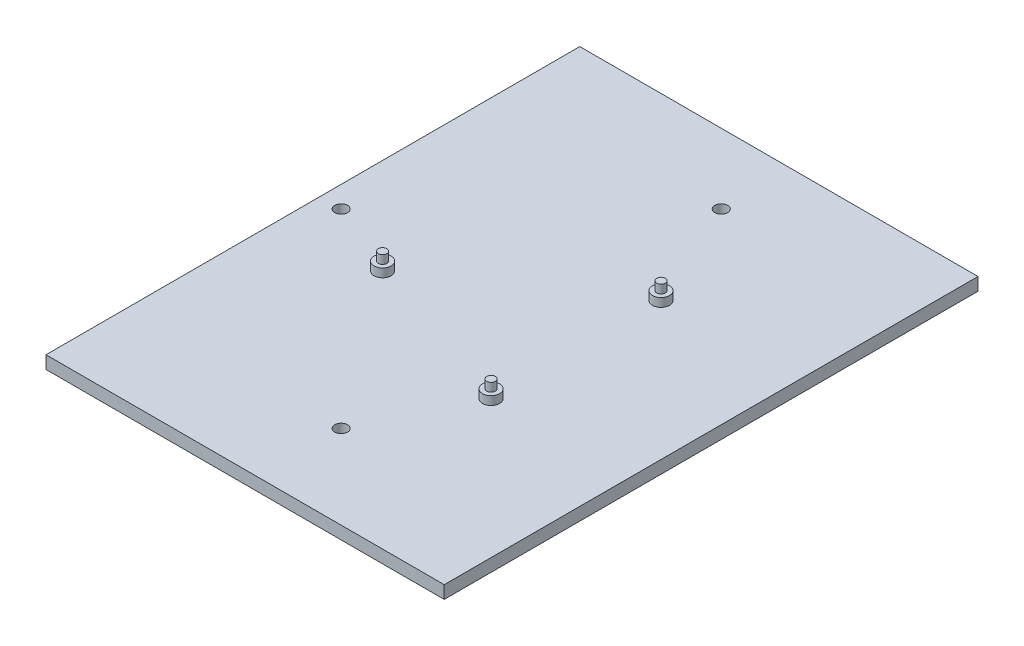
ISO-10303-21;
HEADER;
FILE_DESCRIPTION(('STEP AP214'),'2;1');
FILE_NAME('part.step','',(''),(''),'','','');
FILE_SCHEMA(('AUTOMOTIVE_DESIGN { 1 0 10303 214 1 1 1 1 }'));
ENDSEC;
DATA;
#1=APPLICATION_CONTEXT('core data for automotive mechanical design processes');
#2=APPLICATION_PROTOCOL_DEFINITION('international standard','automotive_design',2000,#1);
#3=PRODUCT_CONTEXT('',#1,'mechanical');
#4=PRODUCT('Part','Part','',(#3));
#5=PRODUCT_RELATED_PRODUCT_CATEGORY('part','',(#4));
#6=PRODUCT_DEFINITION_FORMATION('','',#4);
#7=PRODUCT_DEFINITION_CONTEXT('part definition',#1,'design');
#8=PRODUCT_DEFINITION('design','',#6,#7);
#9=PRODUCT_DEFINITION_SHAPE('','',#8);
#10=(LENGTH_UNIT() NAMED_UNIT(*) SI_UNIT(.MILLI.,.METRE.));
#11=(NAMED_UNIT(*) PLANE_ANGLE_UNIT() SI_UNIT($,.RADIAN.));
#12=(NAMED_UNIT(*) SI_UNIT($,.STERADIAN.) SOLID_ANGLE_UNIT());
#13=UNCERTAINTY_MEASURE_WITH_UNIT(LENGTH_MEASURE(1.E-05),#10,'distance_accuracy_value','');
#14=(GEOMETRIC_REPRESENTATION_CONTEXT(3) GLOBAL_UNCERTAINTY_ASSIGNED_CONTEXT((#13)) GLOBAL_UNIT_ASSIGNED_CONTEXT((#10,
#11,#12)) REPRESENTATION_CONTEXT('',''));
#15=CARTESIAN_POINT('',(0.,0.,0.));
#16=DIRECTION('',(0.,0.,1.));
#17=DIRECTION('',(1.,0.,0.));
#18=AXIS2_PLACEMENT_3D('',#15,#16,#17);
#19=CARTESIAN_POINT('',(-53.4821345927073,3.,-119.324464745772));
#20=DIRECTION('',(1.,0.,0.));
#21=DIRECTION('',(0.,0.,-1.));
#22=AXIS2_PLACEMENT_3D('',#19,#20,#21);
#23=PLANE('',#22);
#24=DIRECTION('',(0.,0.,1.));
#25=VECTOR('',#24,1.);
#26=CARTESIAN_POINT('',(-53.4821345927073,0.,-119.324464745772));
#27=LINE('',#26,#25);
#28=CARTESIAN_POINT('',(-53.4821345927073,0.,-119.324464745772));
#29=VERTEX_POINT('',#28);
#30=CARTESIAN_POINT('',(-53.4821345927072,0.,5.67553525422774));
#31=VERTEX_POINT('',#30);
#32=EDGE_CURVE('E95',#29,#31,#27,.T.);
#33=ORIENTED_EDGE('',*,*,#32,.T.);
#34=DIRECTION('',(0.,-1.,0.));
#35=VECTOR('',#34,1.);
#36=CARTESIAN_POINT('',(-53.4821345927072,3.,5.67553525422774));
#37=LINE('',#36,#35);
#38=CARTESIAN_POINT('',(-53.4821345927072,3.,5.67553525422774));
#39=VERTEX_POINT('',#38);
#40=EDGE_CURVE('E11',#39,#31,#37,.T.);
#41=ORIENTED_EDGE('',*,*,#40,.F.);
#42=DIRECTION('',(0.,0.,1.));
#43=VECTOR('',#42,1.);
#44=CARTESIAN_POINT('',(-53.4821345927073,3.,-119.324464745772));
#45=LINE('',#44,#43);
#46=CARTESIAN_POINT('',(-53.4821345927073,3.,-119.324464745772));
#47=VERTEX_POINT('',#46);
#48=EDGE_CURVE('E83',#47,#39,#45,.T.);
#49=ORIENTED_EDGE('',*,*,#48,.F.);
#50=DIRECTION('',(0.,-1.,0.));
#51=VECTOR('',#50,1.);
#52=CARTESIAN_POINT('',(-53.4821345927073,3.,-119.324464745772));
#53=LINE('',#52,#51);
#54=EDGE_CURVE('E91',#47,#29,#53,.T.);
#55=ORIENTED_EDGE('',*,*,#54,.T.);
#56=EDGE_LOOP('',(#33,#41,#49,#55));
#57=FACE_BOUND('',#56,.T.);
#58=ADVANCED_FACE('F32',(#57),#23,.F.);
#59=CARTESIAN_POINT('',(-53.4821345927072,3.,5.67553525422774));
#60=DIRECTION('',(0.,0.,-1.));
#61=DIRECTION('',(-1.,0.,0.));
#62=AXIS2_PLACEMENT_3D('',#59,#60,#61);
#63=PLANE('',#62);
#64=DIRECTION('',(1.,0.,0.));
#65=VECTOR('',#64,1.);
#66=CARTESIAN_POINT('',(-53.4821345927072,0.,5.67553525422774));
#67=LINE('',#66,#65);
#68=CARTESIAN_POINT('',(39.7678654072928,0.,5.67553525422774));
#69=VERTEX_POINT('',#68);
#70=EDGE_CURVE('E87',#31,#69,#67,.T.);
#71=ORIENTED_EDGE('',*,*,#70,.T.);
#72=DIRECTION('',(0.,-1.,0.));
#73=VECTOR('',#72,1.);
#74=CARTESIAN_POINT('',(39.7678654072928,3.,5.67553525422774));
#75=LINE('',#74,#73);
#76=CARTESIAN_POINT('',(39.7678654072928,3.,5.67553525422774));
#77=VERTEX_POINT('',#76);
#78=EDGE_CURVE('E40',#77,#69,#75,.T.);
#79=ORIENTED_EDGE('',*,*,#78,.F.);
#80=DIRECTION('',(1.,0.,0.));
#81=VECTOR('',#80,1.);
#82=CARTESIAN_POINT('',(-53.4821345927072,3.,5.67553525422774));
#83=LINE('',#82,#81);
#84=EDGE_CURVE('E78',#39,#77,#83,.T.);
#85=ORIENTED_EDGE('',*,*,#84,.F.);
#86=ORIENTED_EDGE('',*,*,#40,.T.);
#87=EDGE_LOOP('',(#71,#79,#85,#86));
#88=FACE_BOUND('',#87,.T.);
#89=ADVANCED_FACE('F86',(#88),#63,.F.);
#90=CARTESIAN_POINT('',(39.7678654072927,3.,-119.324464745772));
#91=DIRECTION('',(-1.,0.,0.));
#92=DIRECTION('',(0.,0.,1.));
#93=AXIS2_PLACEMENT_3D('',#90,#91,#92);
#94=PLANE('',#93);
#95=DIRECTION('',(0.,0.,-1.));
#96=VECTOR('',#95,1.);
#97=CARTESIAN_POINT('',(39.7678654072927,0.,-119.324464745772));
#98=LINE('',#97,#96);
#99=CARTESIAN_POINT('',(39.7678654072927,0.,-119.324464745772));
#100=VERTEX_POINT('',#99);
#101=EDGE_CURVE('E65',#69,#100,#98,.T.);
#102=ORIENTED_EDGE('',*,*,#101,.T.);
#103=DIRECTION('',(0.,-1.,0.));
#104=VECTOR('',#103,1.);
#105=CARTESIAN_POINT('',(39.7678654072927,3.,-119.324464745772));
#106=LINE('',#105,#104);
#107=CARTESIAN_POINT('',(39.7678654072927,3.,-119.324464745772));
#108=VERTEX_POINT('',#107);
#109=EDGE_CURVE('E88',#108,#100,#106,.T.);
#110=ORIENTED_EDGE('',*,*,#109,.F.);
#111=DIRECTION('',(0.,0.,-1.));
#112=VECTOR('',#111,1.);
#113=CARTESIAN_POINT('',(39.7678654072927,3.,-119.324464745772));
#114=LINE('',#113,#112);
#115=EDGE_CURVE('E81',#77,#108,#114,.T.);
#116=ORIENTED_EDGE('',*,*,#115,.F.);
#117=ORIENTED_EDGE('',*,*,#78,.T.);
#118=EDGE_LOOP('',(#102,#110,#116,#117));
#119=FACE_BOUND('',#118,.T.);
#120=ADVANCED_FACE('F89',(#119),#94,.F.);
#121=CARTESIAN_POINT('',(-53.4821345927073,3.,-119.324464745772));
#122=DIRECTION('',(0.,0.,1.));
#123=DIRECTION('',(1.,0.,0.));
#124=AXIS2_PLACEMENT_3D('',#121,#122,#123);
#125=PLANE('',#124);
#126=DIRECTION('',(-1.,0.,0.));
#127=VECTOR('',#126,1.);
#128=CARTESIAN_POINT('',(-53.4821345927073,0.,-119.324464745772));
#129=LINE('',#128,#127);
#130=EDGE_CURVE('E71',#100,#29,#129,.T.);
#131=ORIENTED_EDGE('',*,*,#130,.T.);
#132=ORIENTED_EDGE('',*,*,#54,.F.);
#133=DIRECTION('',(-1.,0.,0.));
#134=VECTOR('',#133,1.);
#135=CARTESIAN_POINT('',(-53.4821345927073,3.,-119.324464745772));
#136=LINE('',#135,#134);
#137=EDGE_CURVE('E48',#108,#47,#136,.T.);
#138=ORIENTED_EDGE('',*,*,#137,.F.);
#139=ORIENTED_EDGE('',*,*,#109,.T.);
#140=EDGE_LOOP('',(#131,#132,#138,#139));
#141=FACE_BOUND('',#140,.T.);
#142=ADVANCED_FACE('F103',(#141),#125,.F.);
#143=CARTESIAN_POINT('',(0.,3.,0.));
#144=DIRECTION('',(0.,1.,0.));
#145=DIRECTION('',(0.,0.,1.));
#146=AXIS2_PLACEMENT_3D('',#143,#144,#145);
#147=PLANE('',#146);
#148=CARTESIAN_POINT('',(7.51786540729252,3.,-37.5479410708664));
#149=DIRECTION('',(0.,1.,0.));
#150=DIRECTION('',(0.,0.,1.));
#151=AXIS2_PLACEMENT_3D('',#148,#149,#150);
#152=CIRCLE('',#151,2.);
#153=CARTESIAN_POINT('',(7.51786540729252,3.,-35.5479410708664));
#154=VERTEX_POINT('',#153);
#155=EDGE_CURVE('E148',#154,#154,#152,.T.);
#156=ORIENTED_EDGE('',*,*,#155,.F.);
#157=EDGE_LOOP('',(#156));
#158=FACE_BOUND('',#157,.T.);
#159=CARTESIAN_POINT('',(7.51786540729251,3.,-77.3479410708663));
#160=DIRECTION('',(0.,1.,0.));
#161=DIRECTION('',(0.,0.,1.));
#162=AXIS2_PLACEMENT_3D('',#159,#160,#161);
#163=CIRCLE('',#162,2.);
#164=CARTESIAN_POINT('',(7.51786540729251,3.,-75.3479410708663));
#165=VERTEX_POINT('',#164);
#166=EDGE_CURVE('E139',#165,#165,#163,.T.);
#167=ORIENTED_EDGE('',*,*,#166,.F.);
#168=EDGE_LOOP('',(#167));
#169=FACE_BOUND('',#168,.T.);
#170=CARTESIAN_POINT('',(-31.0821345927073,3.,-50.74794107088));
#171=DIRECTION('',(0.,1.,0.));
#172=DIRECTION('',(0.,0.,1.));
#173=AXIS2_PLACEMENT_3D('',#170,#171,#172);
#174=CIRCLE('',#173,2.);
#175=CARTESIAN_POINT('',(-31.0821345927073,3.,-48.74794107088));
#176=VERTEX_POINT('',#175);
#177=EDGE_CURVE('E127',#176,#176,#174,.T.);
#178=ORIENTED_EDGE('',*,*,#177,.F.);
#179=EDGE_LOOP('',(#178));
#180=FACE_BOUND('',#179,.T.);
#181=CARTESIAN_POINT('',(-3.98213459270718,3.,-13.9479410708799));
#182=DIRECTION('',(0.,1.,0.));
#183=DIRECTION('',(0.,0.,1.));
#184=AXIS2_PLACEMENT_3D('',#181,#182,#183);
#185=CIRCLE('',#184,1.50000000000005);
#186=CARTESIAN_POINT('',(-3.98213459270718,3.,-12.4479410708799));
#187=VERTEX_POINT('',#186);
#188=EDGE_CURVE('E122',#187,#187,#185,.T.);
#189=ORIENTED_EDGE('',*,*,#188,.F.);
#190=EDGE_LOOP('',(#189));
#191=FACE_BOUND('',#190,.T.);
#192=CARTESIAN_POINT('',(-48.4821345927075,3.,-58.4479410708798));
#193=DIRECTION('',(0.,1.,0.));
#194=DIRECTION('',(0.,0.,1.));
#195=AXIS2_PLACEMENT_3D('',#192,#193,#194);
#196=CIRCLE('',#195,1.50000000000005);
#197=CARTESIAN_POINT('',(-48.4821345927075,3.,-56.9479410708797));
#198=VERTEX_POINT('',#197);
#199=EDGE_CURVE('E115',#198,#198,#196,.T.);
#200=ORIENTED_EDGE('',*,*,#199,.F.);
#201=EDGE_LOOP('',(#200));
#202=FACE_BOUND('',#201,.T.);
#203=CARTESIAN_POINT('',(-3.98213459270749,3.,-102.94794107088));
#204=DIRECTION('',(0.,1.,0.));
#205=DIRECTION('',(0.,0.,1.));
#206=AXIS2_PLACEMENT_3D('',#203,#204,#205);
#207=CIRCLE('',#206,1.50000000000005);
#208=CARTESIAN_POINT('',(-3.98213459270749,3.,-101.44794107088));
#209=VERTEX_POINT('',#208);
#210=EDGE_CURVE('E109',#209,#209,#207,.T.);
#211=ORIENTED_EDGE('',*,*,#210,.F.);
#212=EDGE_LOOP('',(#211));
#213=FACE_BOUND('',#212,.T.);
#214=ORIENTED_EDGE('',*,*,#48,.T.);
#215=ORIENTED_EDGE('',*,*,#84,.T.);
#216=ORIENTED_EDGE('',*,*,#115,.T.);
#217=ORIENTED_EDGE('',*,*,#137,.T.);
#218=EDGE_LOOP('',(#214,#215,#216,#217));
#219=FACE_BOUND('',#218,.T.);
#220=ADVANCED_FACE('F79',(#158,#169,#180,#191,#202,#213,#219),#147,.T.);
#221=CARTESIAN_POINT('',(0.,0.,0.));
#222=DIRECTION('',(0.,1.,0.));
#223=DIRECTION('',(0.,0.,1.));
#224=AXIS2_PLACEMENT_3D('',#221,#222,#223);
#225=PLANE('',#224);
#226=CARTESIAN_POINT('',(-3.98213459270718,0.,-13.9479410708799));
#227=DIRECTION('',(0.,1.,0.));
#228=DIRECTION('',(0.,0.,1.));
#229=AXIS2_PLACEMENT_3D('',#226,#227,#228);
#230=CIRCLE('',#229,1.50000000000005);
#231=CARTESIAN_POINT('',(-3.98213459270718,0.,-12.4479410708799));
#232=VERTEX_POINT('',#231);
#233=EDGE_CURVE('E112',#232,#232,#230,.T.);
#234=ORIENTED_EDGE('',*,*,#233,.T.);
#235=EDGE_LOOP('',(#234));
#236=FACE_BOUND('',#235,.T.);
#237=CARTESIAN_POINT('',(-48.4821345927075,0.,-58.4479410708798));
#238=DIRECTION('',(0.,1.,0.));
#239=DIRECTION('',(0.,0.,1.));
#240=AXIS2_PLACEMENT_3D('',#237,#238,#239);
#241=CIRCLE('',#240,1.50000000000005);
#242=CARTESIAN_POINT('',(-48.4821345927075,0.,-56.9479410708797));
#243=VERTEX_POINT('',#242);
#244=EDGE_CURVE('E118',#243,#243,#241,.T.);
#245=ORIENTED_EDGE('',*,*,#244,.T.);
#246=EDGE_LOOP('',(#245));
#247=FACE_BOUND('',#246,.T.);
#248=CARTESIAN_POINT('',(-3.98213459270749,0.,-102.94794107088));
#249=DIRECTION('',(0.,1.,0.));
#250=DIRECTION('',(0.,0.,1.));
#251=AXIS2_PLACEMENT_3D('',#248,#249,#250);
#252=CIRCLE('',#251,1.50000000000005);
#253=CARTESIAN_POINT('',(-3.98213459270749,0.,-101.44794107088));
#254=VERTEX_POINT('',#253);
#255=EDGE_CURVE('E98',#254,#254,#252,.T.);
#256=ORIENTED_EDGE('',*,*,#255,.T.);
#257=EDGE_LOOP('',(#256));
#258=FACE_BOUND('',#257,.T.);
#259=ORIENTED_EDGE('',*,*,#32,.F.);
#260=ORIENTED_EDGE('',*,*,#130,.F.);
#261=ORIENTED_EDGE('',*,*,#101,.F.);
#262=ORIENTED_EDGE('',*,*,#70,.F.);
#263=EDGE_LOOP('',(#259,#260,#261,#262));
#264=FACE_BOUND('',#263,.T.);
#265=ADVANCED_FACE('F106',(#236,#247,#258,#264),#225,.F.);
#266=CARTESIAN_POINT('',(-3.98213459270749,0.,-102.94794107088));
#267=DIRECTION('',(0.,1.,0.));
#268=DIRECTION('',(0.,0.,1.));
#269=AXIS2_PLACEMENT_3D('',#266,#267,#268);
#270=CYLINDRICAL_SURFACE('',#269,1.50000000000005);
#271=ORIENTED_EDGE('',*,*,#255,.F.);
#272=EDGE_LOOP('',(#271));
#273=FACE_BOUND('',#272,.T.);
#274=ORIENTED_EDGE('',*,*,#210,.T.);
#275=EDGE_LOOP('',(#274));
#276=FACE_BOUND('',#275,.T.);
#277=ADVANCED_FACE('F191',(#273,#276),#270,.F.);
#278=CARTESIAN_POINT('',(-48.4821345927075,0.,-58.4479410708798));
#279=DIRECTION('',(0.,1.,0.));
#280=DIRECTION('',(0.,0.,1.));
#281=AXIS2_PLACEMENT_3D('',#278,#279,#280);
#282=CYLINDRICAL_SURFACE('',#281,1.50000000000005);
#283=ORIENTED_EDGE('',*,*,#244,.F.);
#284=EDGE_LOOP('',(#283));
#285=FACE_BOUND('',#284,.T.);
#286=ORIENTED_EDGE('',*,*,#199,.T.);
#287=EDGE_LOOP('',(#286));
#288=FACE_BOUND('',#287,.T.);
#289=ADVANCED_FACE('F198',(#285,#288),#282,.F.);
#290=CARTESIAN_POINT('',(-3.98213459270718,0.,-13.9479410708799));
#291=DIRECTION('',(0.,1.,0.));
#292=DIRECTION('',(0.,0.,1.));
#293=AXIS2_PLACEMENT_3D('',#290,#291,#292);
#294=CYLINDRICAL_SURFACE('',#293,1.50000000000005);
#295=ORIENTED_EDGE('',*,*,#233,.F.);
#296=EDGE_LOOP('',(#295));
#297=FACE_BOUND('',#296,.T.);
#298=ORIENTED_EDGE('',*,*,#188,.T.);
#299=EDGE_LOOP('',(#298));
#300=FACE_BOUND('',#299,.T.);
#301=ADVANCED_FACE('F202',(#297,#300),#294,.F.);
#302=CARTESIAN_POINT('',(-31.0821345927073,5.,-50.74794107088));
#303=DIRECTION('',(0.,1.,0.));
#304=DIRECTION('',(0.,0.,1.));
#305=AXIS2_PLACEMENT_3D('',#302,#303,#304);
#306=PLANE('',#305);
#307=CARTESIAN_POINT('',(-31.0821345927073,5.,-50.74794107088));
#308=DIRECTION('',(0.,1.,0.));
#309=DIRECTION('',(0.,0.,1.));
#310=AXIS2_PLACEMENT_3D('',#307,#308,#309);
#311=CIRCLE('',#310,2.);
#312=CARTESIAN_POINT('',(-31.0821345927073,5.,-48.74794107088));
#313=VERTEX_POINT('',#312);
#314=EDGE_CURVE('E119',#313,#313,#311,.T.);
#315=ORIENTED_EDGE('',*,*,#314,.T.);
#316=EDGE_LOOP('',(#315));
#317=FACE_BOUND('',#316,.T.);
#318=CARTESIAN_POINT('',(-31.0821345927073,5.,-50.74794107088));
#319=DIRECTION('',(0.,1.,0.));
#320=DIRECTION('',(0.,0.,1.));
#321=AXIS2_PLACEMENT_3D('',#318,#319,#320);
#322=CIRCLE('',#321,1.);
#323=CARTESIAN_POINT('',(-31.0821345927073,5.,-49.74794107088));
#324=VERTEX_POINT('',#323);
#325=EDGE_CURVE('E130',#324,#324,#322,.T.);
#326=ORIENTED_EDGE('',*,*,#325,.F.);
#327=EDGE_LOOP('',(#326));
#328=FACE_BOUND('',#327,.T.);
#329=ADVANCED_FACE('F206',(#317,#328),#306,.T.);
#330=CARTESIAN_POINT('',(-31.0821345927073,5.,-50.74794107088));
#331=DIRECTION('',(0.,-1.,0.));
#332=DIRECTION('',(0.,0.,-1.));
#333=AXIS2_PLACEMENT_3D('',#330,#331,#332);
#334=CYLINDRICAL_SURFACE('',#333,2.);
#335=ORIENTED_EDGE('',*,*,#314,.F.);
#336=EDGE_LOOP('',(#335));
#337=FACE_BOUND('',#336,.T.);
#338=ORIENTED_EDGE('',*,*,#177,.T.);
#339=EDGE_LOOP('',(#338));
#340=FACE_BOUND('',#339,.T.);
#341=ADVANCED_FACE('F208',(#337,#340),#334,.T.);
#342=CARTESIAN_POINT('',(-31.0821345927073,7.,-50.74794107088));
#343=DIRECTION('',(0.,-1.,0.));
#344=DIRECTION('',(0.,0.,-1.));
#345=AXIS2_PLACEMENT_3D('',#342,#343,#344);
#346=CYLINDRICAL_SURFACE('',#345,1.);
#347=ORIENTED_EDGE('',*,*,#325,.T.);
#348=EDGE_LOOP('',(#347));
#349=FACE_BOUND('',#348,.T.);
#350=CARTESIAN_POINT('',(-31.0821345927073,7.,-50.74794107088));
#351=DIRECTION('',(0.,1.,0.));
#352=DIRECTION('',(0.,0.,1.));
#353=AXIS2_PLACEMENT_3D('',#350,#351,#352);
#354=CIRCLE('',#353,1.);
#355=CARTESIAN_POINT('',(-31.0821345927073,7.,-49.74794107088));
#356=VERTEX_POINT('',#355);
#357=EDGE_CURVE('E135',#356,#356,#354,.T.);
#358=ORIENTED_EDGE('',*,*,#357,.F.);
#359=EDGE_LOOP('',(#358));
#360=FACE_BOUND('',#359,.T.);
#361=ADVANCED_FACE('F211',(#349,#360),#346,.T.);
#362=CARTESIAN_POINT('',(-31.0821345927073,7.,-50.74794107088));
#363=DIRECTION('',(0.,1.,0.));
#364=DIRECTION('',(0.,0.,1.));
#365=AXIS2_PLACEMENT_3D('',#362,#363,#364);
#366=PLANE('',#365);
#367=ORIENTED_EDGE('',*,*,#357,.T.);
#368=EDGE_LOOP('',(#367));
#369=FACE_BOUND('',#368,.T.);
#370=ADVANCED_FACE('F218',(#369),#366,.T.);
#371=CARTESIAN_POINT('',(7.51786540729251,5.,-77.3479410708663));
#372=DIRECTION('',(0.,1.,0.));
#373=DIRECTION('',(0.,0.,1.));
#374=AXIS2_PLACEMENT_3D('',#371,#372,#373);
#375=PLANE('',#374);
#376=CARTESIAN_POINT('',(7.51786540729251,5.,-77.3479410708663));
#377=DIRECTION('',(0.,1.,0.));
#378=DIRECTION('',(0.,0.,1.));
#379=AXIS2_PLACEMENT_3D('',#376,#377,#378);
#380=CIRCLE('',#379,2.);
#381=CARTESIAN_POINT('',(7.51786540729251,5.,-75.3479410708663));
#382=VERTEX_POINT('',#381);
#383=EDGE_CURVE('E138',#382,#382,#380,.T.);
#384=ORIENTED_EDGE('',*,*,#383,.T.);
#385=EDGE_LOOP('',(#384));
#386=FACE_BOUND('',#385,.T.);
#387=CARTESIAN_POINT('',(7.51786540729251,5.,-77.3479410708663));
#388=DIRECTION('',(0.,1.,0.));
#389=DIRECTION('',(0.,0.,1.));
#390=AXIS2_PLACEMENT_3D('',#387,#388,#389);
#391=CIRCLE('',#390,1.);
#392=CARTESIAN_POINT('',(7.51786540729251,5.,-76.3479410708663));
#393=VERTEX_POINT('',#392);
#394=EDGE_CURVE('E142',#393,#393,#391,.T.);
#395=ORIENTED_EDGE('',*,*,#394,.F.);
#396=EDGE_LOOP('',(#395));
#397=FACE_BOUND('',#396,.T.);
#398=ADVANCED_FACE('F222',(#386,#397),#375,.T.);
#399=CARTESIAN_POINT('',(7.51786540729251,5.,-77.3479410708663));
#400=DIRECTION('',(0.,-1.,0.));
#401=DIRECTION('',(0.,0.,-1.));
#402=AXIS2_PLACEMENT_3D('',#399,#400,#401);
#403=CYLINDRICAL_SURFACE('',#402,2.);
#404=ORIENTED_EDGE('',*,*,#383,.F.);
#405=EDGE_LOOP('',(#404));
#406=FACE_BOUND('',#405,.T.);
#407=ORIENTED_EDGE('',*,*,#166,.T.);
#408=EDGE_LOOP('',(#407));
#409=FACE_BOUND('',#408,.T.);
#410=ADVANCED_FACE('F224',(#406,#409),#403,.T.);
#411=CARTESIAN_POINT('',(7.51786540729252,5.,-37.5479410708664));
#412=DIRECTION('',(0.,1.,0.));
#413=DIRECTION('',(0.,0.,1.));
#414=AXIS2_PLACEMENT_3D('',#411,#412,#413);
#415=PLANE('',#414);
#416=CARTESIAN_POINT('',(7.51786540729252,5.,-37.5479410708664));
#417=DIRECTION('',(0.,1.,0.));
#418=DIRECTION('',(0.,0.,1.));
#419=AXIS2_PLACEMENT_3D('',#416,#417,#418);
#420=CIRCLE('',#419,2.);
#421=CARTESIAN_POINT('',(7.51786540729252,5.,-35.5479410708664));
#422=VERTEX_POINT('',#421);
#423=EDGE_CURVE('E147',#422,#422,#420,.T.);
#424=ORIENTED_EDGE('',*,*,#423,.T.);
#425=EDGE_LOOP('',(#424));
#426=FACE_BOUND('',#425,.T.);
#427=CARTESIAN_POINT('',(7.51786540729252,5.,-37.5479410708664));
#428=DIRECTION('',(0.,1.,0.));
#429=DIRECTION('',(0.,0.,1.));
#430=AXIS2_PLACEMENT_3D('',#427,#428,#429);
#431=CIRCLE('',#430,1.);
#432=CARTESIAN_POINT('',(7.51786540729252,5.,-36.5479410708664));
#433=VERTEX_POINT('',#432);
#434=EDGE_CURVE('E151',#433,#433,#431,.T.);
#435=ORIENTED_EDGE('',*,*,#434,.F.);
#436=EDGE_LOOP('',(#435));
#437=FACE_BOUND('',#436,.T.);
#438=ADVANCED_FACE('F227',(#426,#437),#415,.T.);
#439=CARTESIAN_POINT('',(7.51786540729252,5.,-37.5479410708664));
#440=DIRECTION('',(0.,-1.,0.));
#441=DIRECTION('',(0.,0.,-1.));
#442=AXIS2_PLACEMENT_3D('',#439,#440,#441);
#443=CYLINDRICAL_SURFACE('',#442,2.);
#444=ORIENTED_EDGE('',*,*,#423,.F.);
#445=EDGE_LOOP('',(#444));
#446=FACE_BOUND('',#445,.T.);
#447=ORIENTED_EDGE('',*,*,#155,.T.);
#448=EDGE_LOOP('',(#447));
#449=FACE_BOUND('',#448,.T.);
#450=ADVANCED_FACE('F232',(#446,#449),#443,.T.);
#451=CARTESIAN_POINT('',(7.51786540729251,7.,-77.3479410708663));
#452=DIRECTION('',(0.,-1.,0.));
#453=DIRECTION('',(0.,0.,-1.));
#454=AXIS2_PLACEMENT_3D('',#451,#452,#453);
#455=CYLINDRICAL_SURFACE('',#454,1.);
#456=ORIENTED_EDGE('',*,*,#394,.T.);
#457=EDGE_LOOP('',(#456));
#458=FACE_BOUND('',#457,.T.);
#459=CARTESIAN_POINT('',(7.51786540729251,7.,-77.3479410708663));
#460=DIRECTION('',(0.,1.,0.));
#461=DIRECTION('',(0.,0.,1.));
#462=AXIS2_PLACEMENT_3D('',#459,#460,#461);
#463=CIRCLE('',#462,1.);
#464=CARTESIAN_POINT('',(7.51786540729251,7.,-76.3479410708663));
#465=VERTEX_POINT('',#464);
#466=EDGE_CURVE('E156',#465,#465,#463,.T.);
#467=ORIENTED_EDGE('',*,*,#466,.F.);
#468=EDGE_LOOP('',(#467));
#469=FACE_BOUND('',#468,.T.);
#470=ADVANCED_FACE('F175',(#458,#469),#455,.T.);
#471=CARTESIAN_POINT('',(7.51786540729251,7.,-77.3479410708663));
#472=DIRECTION('',(0.,1.,0.));
#473=DIRECTION('',(0.,0.,1.));
#474=AXIS2_PLACEMENT_3D('',#471,#472,#473);
#475=PLANE('',#474);
#476=ORIENTED_EDGE('',*,*,#466,.T.);
#477=EDGE_LOOP('',(#476));
#478=FACE_BOUND('',#477,.T.);
#479=ADVANCED_FACE('F167',(#478),#475,.T.);
#480=CARTESIAN_POINT('',(7.51786540729252,7.,-37.5479410708664));
#481=DIRECTION('',(0.,-1.,0.));
#482=DIRECTION('',(0.,0.,-1.));
#483=AXIS2_PLACEMENT_3D('',#480,#481,#482);
#484=CYLINDRICAL_SURFACE('',#483,1.);
#485=ORIENTED_EDGE('',*,*,#434,.T.);
#486=EDGE_LOOP('',(#485));
#487=FACE_BOUND('',#486,.T.);
#488=CARTESIAN_POINT('',(7.51786540729252,7.,-37.5479410708664));
#489=DIRECTION('',(0.,1.,0.));
#490=DIRECTION('',(0.,0.,1.));
#491=AXIS2_PLACEMENT_3D('',#488,#489,#490);
#492=CIRCLE('',#491,1.);
#493=CARTESIAN_POINT('',(7.51786540729252,7.,-36.5479410708664));
#494=VERTEX_POINT('',#493);
#495=EDGE_CURVE('E159',#494,#494,#492,.T.);
#496=ORIENTED_EDGE('',*,*,#495,.F.);
#497=EDGE_LOOP('',(#496));
#498=FACE_BOUND('',#497,.T.);
#499=ADVANCED_FACE('F165',(#487,#498),#484,.T.);
#500=CARTESIAN_POINT('',(7.51786540729252,7.,-37.5479410708664));
#501=DIRECTION('',(0.,1.,0.));
#502=DIRECTION('',(0.,0.,1.));
#503=AXIS2_PLACEMENT_3D('',#500,#501,#502);
#504=PLANE('',#503);
#505=ORIENTED_EDGE('',*,*,#495,.T.);
#506=EDGE_LOOP('',(#505));
#507=FACE_BOUND('',#506,.T.);
#508=ADVANCED_FACE('F163',(#507),#504,.T.);
#509=CLOSED_SHELL('',(#58,#89,#120,#142,#220,#265,#277,#289,#301,#329,#341,#361,#370,#398,#410,
#438,#450,#470,#479,#499,#508));
#510=MANIFOLD_SOLID_BREP('B2',#509);
#511=ADVANCED_BREP_SHAPE_REPRESENTATION('',(#18,#510),#14);
#512=SHAPE_DEFINITION_REPRESENTATION(#9,#511);
ENDSEC;
END-ISO-10303-21;
